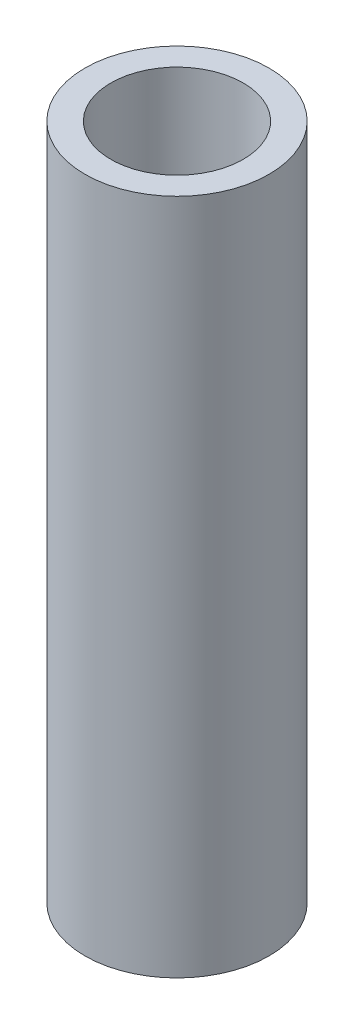
ISO-10303-21;
HEADER;
FILE_DESCRIPTION(('STEP AP214'),'2;1');
FILE_NAME('part.step','',(''),(''),'','','');
FILE_SCHEMA(('AUTOMOTIVE_DESIGN { 1 0 10303 214 1 1 1 1 }'));
ENDSEC;
DATA;
#1=APPLICATION_CONTEXT('core data for automotive mechanical design processes');
#2=APPLICATION_PROTOCOL_DEFINITION('international standard','automotive_design',2000,#1);
#3=PRODUCT_CONTEXT('',#1,'mechanical');
#4=PRODUCT('Part','Part','',(#3));
#5=PRODUCT_RELATED_PRODUCT_CATEGORY('part','',(#4));
#6=PRODUCT_DEFINITION_FORMATION('','',#4);
#7=PRODUCT_DEFINITION_CONTEXT('part definition',#1,'design');
#8=PRODUCT_DEFINITION('design','',#6,#7);
#9=PRODUCT_DEFINITION_SHAPE('','',#8);
#10=(LENGTH_UNIT() NAMED_UNIT(*) SI_UNIT(.MILLI.,.METRE.));
#11=(NAMED_UNIT(*) PLANE_ANGLE_UNIT() SI_UNIT($,.RADIAN.));
#12=(NAMED_UNIT(*) SI_UNIT($,.STERADIAN.) SOLID_ANGLE_UNIT());
#13=UNCERTAINTY_MEASURE_WITH_UNIT(LENGTH_MEASURE(1.E-05),#10,'distance_accuracy_value','');
#14=(GEOMETRIC_REPRESENTATION_CONTEXT(3) GLOBAL_UNCERTAINTY_ASSIGNED_CONTEXT((#13)) GLOBAL_UNIT_ASSIGNED_CONTEXT((#10,
#11,#12)) REPRESENTATION_CONTEXT('',''));
#15=CARTESIAN_POINT('',(0.,0.,0.));
#16=DIRECTION('',(0.,0.,1.));
#17=DIRECTION('',(1.,0.,0.));
#18=AXIS2_PLACEMENT_3D('',#15,#16,#17);
#19=CARTESIAN_POINT('',(-0.0428169189409058,40.448,0.));
#20=DIRECTION('',(0.,1.,0.));
#21=DIRECTION('',(0.,0.,1.));
#22=AXIS2_PLACEMENT_3D('',#19,#20,#21);
#23=PLANE('',#22);
#24=CARTESIAN_POINT('',(-0.0428169189409058,40.448,0.));
#25=DIRECTION('',(0.,1.,0.));
#26=DIRECTION('',(0.,0.,1.));
#27=AXIS2_PLACEMENT_3D('',#24,#25,#26);
#28=CIRCLE('',#27,5.5);
#29=CARTESIAN_POINT('',(-0.0428169189409058,40.448,-5.5));
#30=VERTEX_POINT('',#29);
#31=EDGE_CURVE('E10',#30,#30,#28,.T.);
#32=ORIENTED_EDGE('',*,*,#31,.T.);
#33=EDGE_LOOP('',(#32));
#34=FACE_BOUND('',#33,.T.);
#35=CARTESIAN_POINT('',(-0.0428169189409058,40.448,0.));
#36=DIRECTION('',(0.,1.,0.));
#37=DIRECTION('',(0.,0.,1.));
#38=AXIS2_PLACEMENT_3D('',#35,#36,#37);
#39=CIRCLE('',#38,3.95718308105909);
#40=CARTESIAN_POINT('',(-0.0428169189409058,40.448,-3.95718308105909));
#41=VERTEX_POINT('',#40);
#42=EDGE_CURVE('E46',#41,#41,#39,.T.);
#43=ORIENTED_EDGE('',*,*,#42,.F.);
#44=EDGE_LOOP('',(#43));
#45=FACE_BOUND('',#44,.T.);
#46=ADVANCED_FACE('F35',(#34,#45),#23,.T.);
#47=CARTESIAN_POINT('',(-0.0428169189409058,0.,0.));
#48=DIRECTION('',(0.,1.,0.));
#49=DIRECTION('',(0.,0.,1.));
#50=AXIS2_PLACEMENT_3D('',#47,#48,#49);
#51=PLANE('',#50);
#52=CARTESIAN_POINT('',(-0.0428169189409058,0.,0.));
#53=DIRECTION('',(0.,1.,0.));
#54=DIRECTION('',(0.,0.,1.));
#55=AXIS2_PLACEMENT_3D('',#52,#53,#54);
#56=CIRCLE('',#55,5.5);
#57=CARTESIAN_POINT('',(-0.0428169189409058,0.,-5.5));
#58=VERTEX_POINT('',#57);
#59=EDGE_CURVE('E39',#58,#58,#56,.T.);
#60=ORIENTED_EDGE('',*,*,#59,.F.);
#61=EDGE_LOOP('',(#60));
#62=FACE_BOUND('',#61,.T.);
#63=CARTESIAN_POINT('',(-0.0428169189409058,0.,0.));
#64=DIRECTION('',(0.,1.,0.));
#65=DIRECTION('',(0.,0.,1.));
#66=AXIS2_PLACEMENT_3D('',#63,#64,#65);
#67=CIRCLE('',#66,3.95718308105909);
#68=CARTESIAN_POINT('',(-0.0428169189409058,0.,-3.95718308105909));
#69=VERTEX_POINT('',#68);
#70=EDGE_CURVE('E48',#69,#69,#67,.T.);
#71=ORIENTED_EDGE('',*,*,#70,.T.);
#72=EDGE_LOOP('',(#71));
#73=FACE_BOUND('',#72,.T.);
#74=ADVANCED_FACE('F58',(#62,#73),#51,.F.);
#75=CARTESIAN_POINT('',(-0.0428169189409058,40.448,0.));
#76=DIRECTION('',(0.,-1.,0.));
#77=DIRECTION('',(0.,0.,-1.));
#78=AXIS2_PLACEMENT_3D('',#75,#76,#77);
#79=CYLINDRICAL_SURFACE('',#78,5.5);
#80=CARTESIAN_POINT('',(-0.0428169189409058,40.448,-5.5));
#81=CARTESIAN_POINT('',(-0.0428169189409058,40.0266666666667,-5.5));
#82=CARTESIAN_POINT('',(-0.0428169189409058,39.6053333333333,-5.5));
#83=CARTESIAN_POINT('',(-0.0428169189409058,38.7626666666667,-5.5));
#84=CARTESIAN_POINT('',(-0.0428169189409058,38.3413333333333,-5.5));
#85=CARTESIAN_POINT('',(-0.0428169189409058,37.4986666666667,-5.5));
#86=CARTESIAN_POINT('',(-0.0428169189409058,37.0773333333333,-5.5));
#87=CARTESIAN_POINT('',(-0.0428169189409058,36.2346666666667,-5.5));
#88=CARTESIAN_POINT('',(-0.0428169189409058,35.8133333333333,-5.5));
#89=CARTESIAN_POINT('',(-0.0428169189409058,34.9706666666667,-5.5));
#90=CARTESIAN_POINT('',(-0.0428169189409058,34.5493333333333,-5.5));
#91=CARTESIAN_POINT('',(-0.0428169189409058,33.7066666666667,-5.5));
#92=CARTESIAN_POINT('',(-0.0428169189409058,33.2853333333333,-5.5));
#93=CARTESIAN_POINT('',(-0.0428169189409058,32.4426666666667,-5.5));
#94=CARTESIAN_POINT('',(-0.0428169189409058,32.0213333333333,-5.5));
#95=CARTESIAN_POINT('',(-0.0428169189409058,31.1786666666667,-5.5));
#96=CARTESIAN_POINT('',(-0.0428169189409058,30.7573333333333,-5.5));
#97=CARTESIAN_POINT('',(-0.0428169189409058,29.9146666666667,-5.5));
#98=CARTESIAN_POINT('',(-0.0428169189409058,29.4933333333333,-5.5));
#99=CARTESIAN_POINT('',(-0.0428169189409058,28.6506666666667,-5.5));
#100=CARTESIAN_POINT('',(-0.0428169189409058,28.2293333333333,-5.5));
#101=CARTESIAN_POINT('',(-0.0428169189409058,27.3866666666667,-5.5));
#102=CARTESIAN_POINT('',(-0.0428169189409058,26.9653333333333,-5.5));
#103=CARTESIAN_POINT('',(-0.0428169189409058,26.1226666666667,-5.5));
#104=CARTESIAN_POINT('',(-0.0428169189409058,25.7013333333333,-5.5));
#105=CARTESIAN_POINT('',(-0.0428169189409058,24.8586666666667,-5.5));
#106=CARTESIAN_POINT('',(-0.0428169189409058,24.4373333333333,-5.5));
#107=CARTESIAN_POINT('',(-0.0428169189409058,23.5946666666667,-5.5));
#108=CARTESIAN_POINT('',(-0.0428169189409058,23.1733333333333,-5.5));
#109=CARTESIAN_POINT('',(-0.0428169189409058,22.3306666666667,-5.5));
#110=CARTESIAN_POINT('',(-0.0428169189409058,21.9093333333333,-5.5));
#111=CARTESIAN_POINT('',(-0.0428169189409058,21.0666666666667,-5.5));
#112=CARTESIAN_POINT('',(-0.0428169189409058,20.6453333333333,-5.5));
#113=CARTESIAN_POINT('',(-0.0428169189409058,19.8026666666667,-5.5));
#114=CARTESIAN_POINT('',(-0.0428169189409058,19.3813333333333,-5.5));
#115=CARTESIAN_POINT('',(-0.0428169189409058,18.5386666666667,-5.5));
#116=CARTESIAN_POINT('',(-0.0428169189409058,18.1173333333333,-5.5));
#117=CARTESIAN_POINT('',(-0.0428169189409058,17.2746666666667,-5.5));
#118=CARTESIAN_POINT('',(-0.0428169189409058,16.8533333333333,-5.5));
#119=CARTESIAN_POINT('',(-0.0428169189409058,16.0106666666667,-5.5));
#120=CARTESIAN_POINT('',(-0.0428169189409058,15.5893333333333,-5.5));
#121=CARTESIAN_POINT('',(-0.0428169189409058,14.7466666666667,-5.5));
#122=CARTESIAN_POINT('',(-0.0428169189409058,14.3253333333333,-5.5));
#123=CARTESIAN_POINT('',(-0.0428169189409058,13.4826666666667,-5.5));
#124=CARTESIAN_POINT('',(-0.0428169189409058,13.0613333333333,-5.5));
#125=CARTESIAN_POINT('',(-0.0428169189409058,12.2186666666667,-5.5));
#126=CARTESIAN_POINT('',(-0.0428169189409058,11.7973333333333,-5.5));
#127=CARTESIAN_POINT('',(-0.0428169189409058,10.9546666666667,-5.5));
#128=CARTESIAN_POINT('',(-0.0428169189409058,10.5333333333333,-5.5));
#129=CARTESIAN_POINT('',(-0.0428169189409058,9.69066666666667,-5.5));
#130=CARTESIAN_POINT('',(-0.0428169189409058,9.26933333333334,-5.5));
#131=CARTESIAN_POINT('',(-0.0428169189409058,8.42666666666667,-5.5));
#132=CARTESIAN_POINT('',(-0.0428169189409058,8.00533333333333,-5.5));
#133=CARTESIAN_POINT('',(-0.0428169189409058,7.16266666666667,-5.5));
#134=CARTESIAN_POINT('',(-0.0428169189409058,6.74133333333333,-5.5));
#135=CARTESIAN_POINT('',(-0.0428169189409058,5.89866666666667,-5.5));
#136=CARTESIAN_POINT('',(-0.0428169189409058,5.47733333333333,-5.5));
#137=CARTESIAN_POINT('',(-0.0428169189409058,4.63466666666667,-5.5));
#138=CARTESIAN_POINT('',(-0.0428169189409058,4.21333333333334,-5.5));
#139=CARTESIAN_POINT('',(-0.0428169189409058,3.37066666666667,-5.5));
#140=CARTESIAN_POINT('',(-0.0428169189409058,2.94933333333334,-5.5));
#141=CARTESIAN_POINT('',(-0.0428169189409058,2.10666666666667,-5.5));
#142=CARTESIAN_POINT('',(-0.0428169189409058,1.68533333333333,-5.5));
#143=CARTESIAN_POINT('',(-0.0428169189409058,0.842666666666668,-5.5));
#144=CARTESIAN_POINT('',(-0.0428169189409058,0.421333333333333,-5.5));
#145=CARTESIAN_POINT('',(-0.0428169189409058,0.,-5.5));
#146=B_SPLINE_CURVE_WITH_KNOTS('',3,(#80,#81,#82,#83,#84,#85,#86,#87,#88,#89,#90,#91,#92,#93,
#94,#95,#96,#97,#98,#99,#100,#101,#102,#103,#104,#105,#106,#107,#108,#109,#110,#111,#112,#113,
#114,#115,#116,#117,#118,#119,#120,#121,#122,#123,#124,#125,#126,#127,#128,#129,#130,#131,#132,
#133,#134,#135,#136,#137,#138,#139,#140,#141,#142,#143,#144,#145),.UNSPECIFIED.,.F.,.F.,(4,2,2,
2,2,2,2,2,2,2,2,2,2,2,2,2,2,2,2,2,2,2,2,2,2,2,2,2,2,2,2,2,4),(0.,1.26399999999999,2.528,3.792,
5.056,6.32,7.58399999999999,8.848,10.112,11.376,12.64,13.904,15.168,16.432,17.696,18.96,20.224,
21.488,22.752,24.016,25.28,26.544,27.808,29.072,30.336,31.6,32.864,34.128,35.392,36.656,37.92,
39.184,40.448),.UNSPECIFIED.);
#147=EDGE_CURVE('BSEAM37',#30,#58,#146,.T.);
#148=ORIENTED_EDGE('',*,*,#31,.F.);
#149=ORIENTED_EDGE('',*,*,#59,.T.);
#150=ORIENTED_EDGE('',*,*,#147,.T.);
#151=ORIENTED_EDGE('',*,*,#147,.F.);
#152=EDGE_LOOP('',(#148,#150,#149,#151));
#153=FACE_BOUND('',#152,.T.);
#154=ADVANCED_FACE('F37',(#153),#79,.T.);
#155=CARTESIAN_POINT('',(-0.0428169189409058,40.448,0.));
#156=DIRECTION('',(0.,-1.,0.));
#157=DIRECTION('',(0.,0.,-1.));
#158=AXIS2_PLACEMENT_3D('',#155,#156,#157);
#159=CYLINDRICAL_SURFACE('',#158,3.95718308105909);
#160=CARTESIAN_POINT('',(-0.0428169189409058,40.448,-3.95718308105909));
#161=CARTESIAN_POINT('',(-0.0428169189409058,40.0266666666667,-3.95718308105909));
#162=CARTESIAN_POINT('',(-0.0428169189409058,39.6053333333333,-3.95718308105909));
#163=CARTESIAN_POINT('',(-0.0428169189409058,38.7626666666667,-3.95718308105909));
#164=CARTESIAN_POINT('',(-0.0428169189409058,38.3413333333333,-3.95718308105909));
#165=CARTESIAN_POINT('',(-0.0428169189409058,37.4986666666667,-3.95718308105909));
#166=CARTESIAN_POINT('',(-0.0428169189409058,37.0773333333333,-3.95718308105909));
#167=CARTESIAN_POINT('',(-0.0428169189409058,36.2346666666667,-3.95718308105909));
#168=CARTESIAN_POINT('',(-0.0428169189409058,35.8133333333333,-3.95718308105909));
#169=CARTESIAN_POINT('',(-0.0428169189409058,34.9706666666667,-3.95718308105909));
#170=CARTESIAN_POINT('',(-0.0428169189409058,34.5493333333333,-3.95718308105909));
#171=CARTESIAN_POINT('',(-0.0428169189409058,33.7066666666667,-3.95718308105909));
#172=CARTESIAN_POINT('',(-0.0428169189409058,33.2853333333333,-3.95718308105909));
#173=CARTESIAN_POINT('',(-0.0428169189409058,32.4426666666667,-3.95718308105909));
#174=CARTESIAN_POINT('',(-0.0428169189409058,32.0213333333333,-3.95718308105909));
#175=CARTESIAN_POINT('',(-0.0428169189409058,31.1786666666667,-3.95718308105909));
#176=CARTESIAN_POINT('',(-0.0428169189409058,30.7573333333333,-3.95718308105909));
#177=CARTESIAN_POINT('',(-0.0428169189409058,29.9146666666667,-3.95718308105909));
#178=CARTESIAN_POINT('',(-0.0428169189409058,29.4933333333333,-3.95718308105909));
#179=CARTESIAN_POINT('',(-0.0428169189409058,28.6506666666667,-3.95718308105909));
#180=CARTESIAN_POINT('',(-0.0428169189409058,28.2293333333333,-3.95718308105909));
#181=CARTESIAN_POINT('',(-0.0428169189409058,27.3866666666667,-3.95718308105909));
#182=CARTESIAN_POINT('',(-0.0428169189409058,26.9653333333333,-3.95718308105909));
#183=CARTESIAN_POINT('',(-0.0428169189409058,26.1226666666667,-3.95718308105909));
#184=CARTESIAN_POINT('',(-0.0428169189409058,25.7013333333333,-3.95718308105909));
#185=CARTESIAN_POINT('',(-0.0428169189409058,24.8586666666667,-3.95718308105909));
#186=CARTESIAN_POINT('',(-0.0428169189409058,24.4373333333333,-3.95718308105909));
#187=CARTESIAN_POINT('',(-0.0428169189409058,23.5946666666667,-3.95718308105909));
#188=CARTESIAN_POINT('',(-0.0428169189409058,23.1733333333333,-3.95718308105909));
#189=CARTESIAN_POINT('',(-0.0428169189409058,22.3306666666667,-3.95718308105909));
#190=CARTESIAN_POINT('',(-0.0428169189409058,21.9093333333333,-3.95718308105909));
#191=CARTESIAN_POINT('',(-0.0428169189409058,21.0666666666667,-3.95718308105909));
#192=CARTESIAN_POINT('',(-0.0428169189409058,20.6453333333333,-3.95718308105909));
#193=CARTESIAN_POINT('',(-0.0428169189409058,19.8026666666667,-3.95718308105909));
#194=CARTESIAN_POINT('',(-0.0428169189409058,19.3813333333333,-3.95718308105909));
#195=CARTESIAN_POINT('',(-0.0428169189409058,18.5386666666667,-3.95718308105909));
#196=CARTESIAN_POINT('',(-0.0428169189409058,18.1173333333333,-3.95718308105909));
#197=CARTESIAN_POINT('',(-0.0428169189409058,17.2746666666667,-3.95718308105909));
#198=CARTESIAN_POINT('',(-0.0428169189409058,16.8533333333333,-3.95718308105909));
#199=CARTESIAN_POINT('',(-0.0428169189409058,16.0106666666667,-3.95718308105909));
#200=CARTESIAN_POINT('',(-0.0428169189409058,15.5893333333333,-3.95718308105909));
#201=CARTESIAN_POINT('',(-0.0428169189409058,14.7466666666667,-3.95718308105909));
#202=CARTESIAN_POINT('',(-0.0428169189409058,14.3253333333333,-3.95718308105909));
#203=CARTESIAN_POINT('',(-0.0428169189409058,13.4826666666667,-3.95718308105909));
#204=CARTESIAN_POINT('',(-0.0428169189409058,13.0613333333333,-3.95718308105909));
#205=CARTESIAN_POINT('',(-0.0428169189409058,12.2186666666667,-3.95718308105909));
#206=CARTESIAN_POINT('',(-0.0428169189409058,11.7973333333333,-3.95718308105909));
#207=CARTESIAN_POINT('',(-0.0428169189409058,10.9546666666667,-3.95718308105909));
#208=CARTESIAN_POINT('',(-0.0428169189409058,10.5333333333333,-3.95718308105909));
#209=CARTESIAN_POINT('',(-0.0428169189409058,9.69066666666667,-3.95718308105909));
#210=CARTESIAN_POINT('',(-0.0428169189409058,9.26933333333333,-3.95718308105909));
#211=CARTESIAN_POINT('',(-0.0428169189409058,8.42666666666667,-3.95718308105909));
#212=CARTESIAN_POINT('',(-0.0428169189409058,8.00533333333333,-3.95718308105909));
#213=CARTESIAN_POINT('',(-0.0428169189409058,7.16266666666667,-3.95718308105909));
#214=CARTESIAN_POINT('',(-0.0428169189409058,6.74133333333333,-3.95718308105909));
#215=CARTESIAN_POINT('',(-0.0428169189409058,5.89866666666667,-3.95718308105909));
#216=CARTESIAN_POINT('',(-0.0428169189409058,5.47733333333334,-3.95718308105909));
#217=CARTESIAN_POINT('',(-0.0428169189409058,4.63466666666667,-3.95718308105909));
#218=CARTESIAN_POINT('',(-0.0428169189409058,4.21333333333334,-3.95718308105909));
#219=CARTESIAN_POINT('',(-0.0428169189409058,3.37066666666667,-3.95718308105909));
#220=CARTESIAN_POINT('',(-0.0428169189409058,2.94933333333334,-3.95718308105909));
#221=CARTESIAN_POINT('',(-0.0428169189409058,2.10666666666667,-3.95718308105909));
#222=CARTESIAN_POINT('',(-0.0428169189409058,1.68533333333333,-3.95718308105909));
#223=CARTESIAN_POINT('',(-0.0428169189409058,0.842666666666668,-3.95718308105909));
#224=CARTESIAN_POINT('',(-0.0428169189409058,0.421333333333333,-3.95718308105909));
#225=CARTESIAN_POINT('',(-0.0428169189409058,0.,-3.95718308105909));
#226=B_SPLINE_CURVE_WITH_KNOTS('',3,(#160,#161,#162,#163,#164,#165,#166,#167,#168,#169,#170,
#171,#172,#173,#174,#175,#176,#177,#178,#179,#180,#181,#182,#183,#184,#185,#186,#187,#188,#189,
#190,#191,#192,#193,#194,#195,#196,#197,#198,#199,#200,#201,#202,#203,#204,#205,#206,#207,#208,
#209,#210,#211,#212,#213,#214,#215,#216,#217,#218,#219,#220,#221,#222,#223,#224,#225),
.UNSPECIFIED.,.F.,.F.,(4,2,2,2,2,2,2,2,2,2,2,2,2,2,2,2,2,2,2,2,2,2,2,2,2,2,2,2,2,2,2,2,4),(0.,
1.264,2.528,3.792,5.056,6.32000000000001,7.58400000000001,8.848,10.112,11.376,12.64,13.904,
15.168,16.432,17.696,18.96,20.224,21.488,22.752,24.016,25.28,26.544,27.808,29.072,30.336,31.6,
32.864,34.128,35.392,36.656,37.92,39.184,40.448),.UNSPECIFIED.);
#227=EDGE_CURVE('BSEAM54',#41,#69,#226,.T.);
#228=ORIENTED_EDGE('',*,*,#42,.T.);
#229=ORIENTED_EDGE('',*,*,#70,.F.);
#230=ORIENTED_EDGE('',*,*,#227,.T.);
#231=ORIENTED_EDGE('',*,*,#227,.F.);
#232=EDGE_LOOP('',(#228,#230,#229,#231));
#233=FACE_BOUND('',#232,.T.);
#234=ADVANCED_FACE('F54',(#233),#159,.F.);
#235=CLOSED_SHELL('',(#46,#74,#154,#234));
#236=MANIFOLD_SOLID_BREP('B2',#235);
#237=ADVANCED_BREP_SHAPE_REPRESENTATION('',(#18,#236),#14);
#238=SHAPE_DEFINITION_REPRESENTATION(#9,#237);
ENDSEC;
END-ISO-10303-21;
